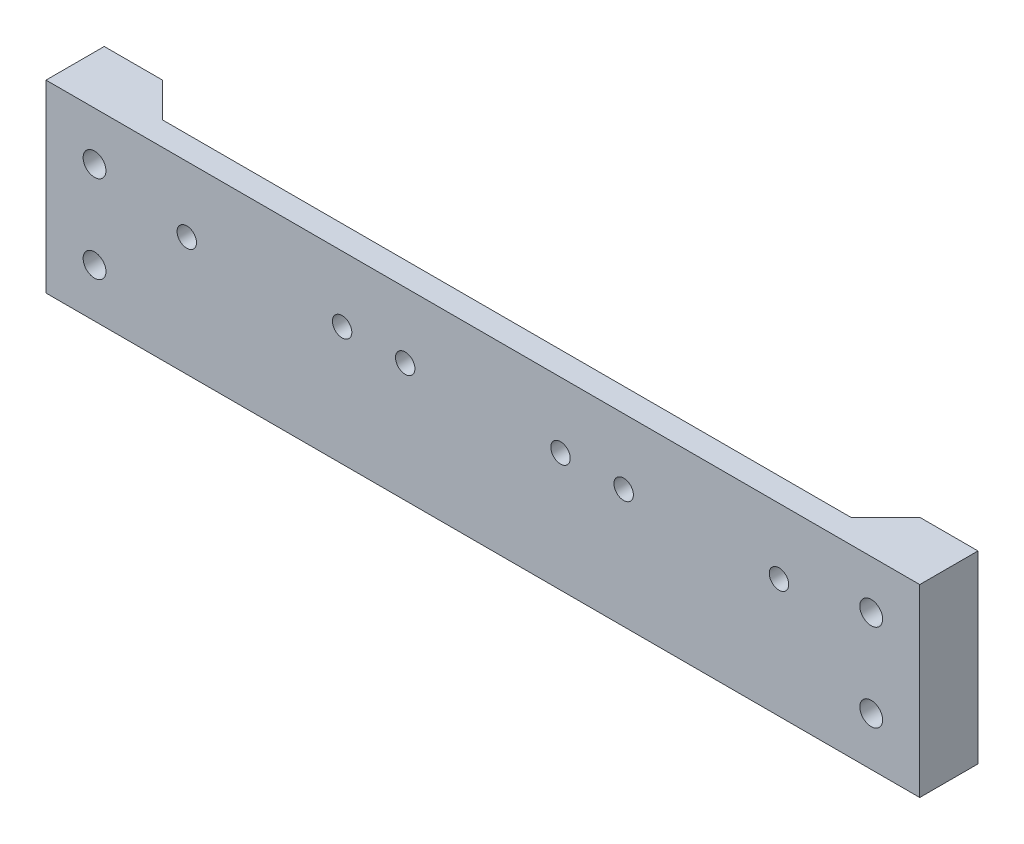
ISO-10303-21;
HEADER;
FILE_DESCRIPTION(('STEP AP214'),'2;1');
FILE_NAME('part.step','',(''),(''),'','','');
FILE_SCHEMA(('AUTOMOTIVE_DESIGN { 1 0 10303 214 1 1 1 1 }'));
ENDSEC;
DATA;
#1=APPLICATION_CONTEXT('core data for automotive mechanical design processes');
#2=APPLICATION_PROTOCOL_DEFINITION('international standard','automotive_design',2000,#1);
#3=PRODUCT_CONTEXT('',#1,'mechanical');
#4=PRODUCT('Part','Part','',(#3));
#5=PRODUCT_RELATED_PRODUCT_CATEGORY('part','',(#4));
#6=PRODUCT_DEFINITION_FORMATION('','',#4);
#7=PRODUCT_DEFINITION_CONTEXT('part definition',#1,'design');
#8=PRODUCT_DEFINITION('design','',#6,#7);
#9=PRODUCT_DEFINITION_SHAPE('','',#8);
#10=(LENGTH_UNIT() NAMED_UNIT(*) SI_UNIT(.MILLI.,.METRE.));
#11=(NAMED_UNIT(*) PLANE_ANGLE_UNIT() SI_UNIT($,.RADIAN.));
#12=(NAMED_UNIT(*) SI_UNIT($,.STERADIAN.) SOLID_ANGLE_UNIT());
#13=UNCERTAINTY_MEASURE_WITH_UNIT(LENGTH_MEASURE(1.E-05),#10,'distance_accuracy_value','');
#14=(GEOMETRIC_REPRESENTATION_CONTEXT(3) GLOBAL_UNCERTAINTY_ASSIGNED_CONTEXT((#13)) GLOBAL_UNIT_ASSIGNED_CONTEXT((#10,
#11,#12)) REPRESENTATION_CONTEXT('',''));
#15=CARTESIAN_POINT('',(0.,0.,0.));
#16=DIRECTION('',(0.,0.,1.));
#17=DIRECTION('',(1.,0.,0.));
#18=AXIS2_PLACEMENT_3D('',#15,#16,#17);
#19=CARTESIAN_POINT('',(0.,0.,0.));
#20=DIRECTION('',(0.,0.,-1.));
#21=DIRECTION('',(-1.,0.,0.));
#22=AXIS2_PLACEMENT_3D('',#19,#20,#21);
#23=PLANE('',#22);
#24=DIRECTION('',(0.,1.,0.));
#25=VECTOR('',#24,1.);
#26=CARTESIAN_POINT('',(168.,-38.,0.));
#27=LINE('',#26,#25);
#28=CARTESIAN_POINT('',(168.,-8.76610373207475,0.));
#29=VERTEX_POINT('',#28);
#30=CARTESIAN_POINT('',(168.,0.,0.));
#31=VERTEX_POINT('',#30);
#32=EDGE_CURVE('E217',#29,#31,#27,.T.);
#33=ORIENTED_EDGE('',*,*,#32,.T.);
#34=DIRECTION('',(-1.,0.,0.));
#35=VECTOR('',#34,1.);
#36=CARTESIAN_POINT('',(0.,0.,0.));
#37=LINE('',#36,#35);
#38=CARTESIAN_POINT('',(180.,0.,0.));
#39=VERTEX_POINT('',#38);
#40=EDGE_CURVE('E168',#39,#31,#37,.T.);
#41=ORIENTED_EDGE('',*,*,#40,.F.);
#42=DIRECTION('',(0.,1.,0.));
#43=VECTOR('',#42,1.);
#44=CARTESIAN_POINT('',(180.,-38.,0.));
#45=LINE('',#44,#43);
#46=CARTESIAN_POINT('',(180.,-38.,0.));
#47=VERTEX_POINT('',#46);
#48=EDGE_CURVE('E160',#47,#39,#45,.T.);
#49=ORIENTED_EDGE('',*,*,#48,.F.);
#50=DIRECTION('',(1.,0.,0.));
#51=VECTOR('',#50,1.);
#52=CARTESIAN_POINT('',(0.,-38.,0.));
#53=LINE('',#52,#51);
#54=CARTESIAN_POINT('',(168.,-38.,0.));
#55=VERTEX_POINT('',#54);
#56=EDGE_CURVE('E161',#55,#47,#53,.T.);
#57=ORIENTED_EDGE('',*,*,#56,.F.);
#58=CARTESIAN_POINT('',(168.,-29.2308270553853,0.));
#59=VERTEX_POINT('',#58);
#60=EDGE_CURVE('E212',#55,#59,#27,.T.);
#61=ORIENTED_EDGE('',*,*,#60,.T.);
#62=CARTESIAN_POINT('',(170.,-27.99693078746,0.));
#63=DIRECTION('',(0.,0.,1.));
#64=DIRECTION('',(1.,0.,0.));
#65=AXIS2_PLACEMENT_3D('',#62,#63,#64);
#66=CIRCLE('',#65,2.35);
#67=CARTESIAN_POINT('',(168.,-26.7630345195348,0.));
#68=VERTEX_POINT('',#67);
#69=EDGE_CURVE('E238',#59,#68,#66,.T.);
#70=ORIENTED_EDGE('',*,*,#69,.T.);
#71=CARTESIAN_POINT('',(168.,-11.2338962679253,0.));
#72=VERTEX_POINT('',#71);
#73=EDGE_CURVE('E216',#68,#72,#27,.T.);
#74=ORIENTED_EDGE('',*,*,#73,.T.);
#75=CARTESIAN_POINT('',(170.,-10.,0.));
#76=DIRECTION('',(0.,0.,1.));
#77=DIRECTION('',(1.,0.,0.));
#78=AXIS2_PLACEMENT_3D('',#75,#76,#77);
#79=CIRCLE('',#78,2.35);
#80=EDGE_CURVE('E232',#72,#29,#79,.T.);
#81=ORIENTED_EDGE('',*,*,#80,.T.);
#82=EDGE_LOOP('',(#33,#41,#49,#57,#61,#70,#74,#81));
#83=FACE_BOUND('',#82,.T.);
#84=ADVANCED_FACE('F37',(#83),#23,.T.);
#85=CARTESIAN_POINT('',(0.,0.,12.));
#86=DIRECTION('',(0.,0.,-1.));
#87=DIRECTION('',(-1.,0.,0.));
#88=AXIS2_PLACEMENT_3D('',#85,#86,#87);
#89=PLANE('',#88);
#90=CARTESIAN_POINT('',(151.,-13.5,12.));
#91=DIRECTION('',(0.,0.,1.));
#92=DIRECTION('',(1.,0.,0.));
#93=AXIS2_PLACEMENT_3D('',#90,#91,#92);
#94=CIRCLE('',#93,2.);
#95=CARTESIAN_POINT('',(153.,-13.5,12.));
#96=VERTEX_POINT('',#95);
#97=EDGE_CURVE('E186',#96,#96,#94,.T.);
#98=ORIENTED_EDGE('',*,*,#97,.F.);
#99=EDGE_LOOP('',(#98));
#100=FACE_BOUND('',#99,.T.);
#101=CARTESIAN_POINT('',(119.,-13.5,12.));
#102=DIRECTION('',(0.,0.,1.));
#103=DIRECTION('',(1.,0.,0.));
#104=AXIS2_PLACEMENT_3D('',#101,#102,#103);
#105=CIRCLE('',#104,2.);
#106=CARTESIAN_POINT('',(121.,-13.5,12.));
#107=VERTEX_POINT('',#106);
#108=EDGE_CURVE('E492',#107,#107,#105,.T.);
#109=ORIENTED_EDGE('',*,*,#108,.F.);
#110=EDGE_LOOP('',(#109));
#111=FACE_BOUND('',#110,.T.);
#112=CARTESIAN_POINT('',(106.,-13.5,12.));
#113=DIRECTION('',(0.,0.,1.));
#114=DIRECTION('',(1.,0.,0.));
#115=AXIS2_PLACEMENT_3D('',#112,#113,#114);
#116=CIRCLE('',#115,2.);
#117=CARTESIAN_POINT('',(108.,-13.5,12.));
#118=VERTEX_POINT('',#117);
#119=EDGE_CURVE('E495',#118,#118,#116,.T.);
#120=ORIENTED_EDGE('',*,*,#119,.F.);
#121=EDGE_LOOP('',(#120));
#122=FACE_BOUND('',#121,.T.);
#123=CARTESIAN_POINT('',(74.,-13.5,12.));
#124=DIRECTION('',(0.,0.,1.));
#125=DIRECTION('',(1.,0.,0.));
#126=AXIS2_PLACEMENT_3D('',#123,#124,#125);
#127=CIRCLE('',#126,2.);
#128=CARTESIAN_POINT('',(76.,-13.5,12.));
#129=VERTEX_POINT('',#128);
#130=EDGE_CURVE('E500',#129,#129,#127,.T.);
#131=ORIENTED_EDGE('',*,*,#130,.F.);
#132=EDGE_LOOP('',(#131));
#133=FACE_BOUND('',#132,.T.);
#134=CARTESIAN_POINT('',(61.,-13.5,12.));
#135=DIRECTION('',(0.,0.,1.));
#136=DIRECTION('',(1.,0.,0.));
#137=AXIS2_PLACEMENT_3D('',#134,#135,#136);
#138=CIRCLE('',#137,2.);
#139=CARTESIAN_POINT('',(63.,-13.5,12.));
#140=VERTEX_POINT('',#139);
#141=EDGE_CURVE('E503',#140,#140,#138,.T.);
#142=ORIENTED_EDGE('',*,*,#141,.F.);
#143=EDGE_LOOP('',(#142));
#144=FACE_BOUND('',#143,.T.);
#145=CARTESIAN_POINT('',(29.,-13.5,12.));
#146=DIRECTION('',(0.,0.,1.));
#147=DIRECTION('',(1.,0.,0.));
#148=AXIS2_PLACEMENT_3D('',#145,#146,#147);
#149=CIRCLE('',#148,2.);
#150=CARTESIAN_POINT('',(31.,-13.5,12.));
#151=VERTEX_POINT('',#150);
#152=EDGE_CURVE('E506',#151,#151,#149,.T.);
#153=ORIENTED_EDGE('',*,*,#152,.F.);
#154=EDGE_LOOP('',(#153));
#155=FACE_BOUND('',#154,.T.);
#156=DIRECTION('',(0.,-1.,0.));
#157=VECTOR('',#156,1.);
#158=CARTESIAN_POINT('',(0.,-38.,12.));
#159=LINE('',#158,#157);
#160=CARTESIAN_POINT('',(0.,0.,12.));
#161=VERTEX_POINT('',#160);
#162=CARTESIAN_POINT('',(0.,-38.,12.));
#163=VERTEX_POINT('',#162);
#164=EDGE_CURVE('E171',#161,#163,#159,.T.);
#165=ORIENTED_EDGE('',*,*,#164,.T.);
#166=DIRECTION('',(1.,0.,0.));
#167=VECTOR('',#166,1.);
#168=CARTESIAN_POINT('',(0.,-38.,12.));
#169=LINE('',#168,#167);
#170=CARTESIAN_POINT('',(180.,-38.,12.));
#171=VERTEX_POINT('',#170);
#172=EDGE_CURVE('E92',#163,#171,#169,.T.);
#173=ORIENTED_EDGE('',*,*,#172,.T.);
#174=DIRECTION('',(0.,1.,0.));
#175=VECTOR('',#174,1.);
#176=CARTESIAN_POINT('',(180.,-38.,12.));
#177=LINE('',#176,#175);
#178=CARTESIAN_POINT('',(180.,0.,12.));
#179=VERTEX_POINT('',#178);
#180=EDGE_CURVE('E248',#171,#179,#177,.T.);
#181=ORIENTED_EDGE('',*,*,#180,.T.);
#182=DIRECTION('',(-1.,0.,0.));
#183=VECTOR('',#182,1.);
#184=CARTESIAN_POINT('',(0.,0.,12.));
#185=LINE('',#184,#183);
#186=EDGE_CURVE('E63',#179,#161,#185,.T.);
#187=ORIENTED_EDGE('',*,*,#186,.T.);
#188=EDGE_LOOP('',(#165,#173,#181,#187));
#189=FACE_BOUND('',#188,.T.);
#190=CARTESIAN_POINT('',(170.,-27.99693078746,12.));
#191=DIRECTION('',(0.,0.,1.));
#192=DIRECTION('',(1.,0.,0.));
#193=AXIS2_PLACEMENT_3D('',#190,#191,#192);
#194=CIRCLE('',#193,2.35);
#195=CARTESIAN_POINT('',(172.35,-27.99693078746,12.));
#196=VERTEX_POINT('',#195);
#197=EDGE_CURVE('E241',#196,#196,#194,.T.);
#198=ORIENTED_EDGE('',*,*,#197,.F.);
#199=EDGE_LOOP('',(#198));
#200=FACE_BOUND('',#199,.T.);
#201=CARTESIAN_POINT('',(170.,-10.,12.));
#202=DIRECTION('',(0.,0.,1.));
#203=DIRECTION('',(1.,0.,0.));
#204=AXIS2_PLACEMENT_3D('',#201,#202,#203);
#205=CIRCLE('',#204,2.35);
#206=CARTESIAN_POINT('',(172.35,-10.,12.));
#207=VERTEX_POINT('',#206);
#208=EDGE_CURVE('E235',#207,#207,#205,.T.);
#209=ORIENTED_EDGE('',*,*,#208,.F.);
#210=EDGE_LOOP('',(#209));
#211=FACE_BOUND('',#210,.T.);
#212=CARTESIAN_POINT('',(10.,-10.,12.));
#213=DIRECTION('',(0.,0.,1.));
#214=DIRECTION('',(1.,0.,0.));
#215=AXIS2_PLACEMENT_3D('',#212,#213,#214);
#216=CIRCLE('',#215,2.35);
#217=CARTESIAN_POINT('',(12.35,-10.,12.));
#218=VERTEX_POINT('',#217);
#219=EDGE_CURVE('E229',#218,#218,#216,.T.);
#220=ORIENTED_EDGE('',*,*,#219,.F.);
#221=EDGE_LOOP('',(#220));
#222=FACE_BOUND('',#221,.T.);
#223=CARTESIAN_POINT('',(10.,-27.99693078746,12.));
#224=DIRECTION('',(0.,0.,1.));
#225=DIRECTION('',(1.,0.,0.));
#226=AXIS2_PLACEMENT_3D('',#223,#224,#225);
#227=CIRCLE('',#226,2.35);
#228=CARTESIAN_POINT('',(12.35,-27.99693078746,12.));
#229=VERTEX_POINT('',#228);
#230=EDGE_CURVE('E224',#229,#229,#227,.T.);
#231=ORIENTED_EDGE('',*,*,#230,.F.);
#232=EDGE_LOOP('',(#231));
#233=FACE_BOUND('',#232,.T.);
#234=ADVANCED_FACE('F251',(#100,#111,#122,#133,#144,#155,#189,#200,#211,#222,#233),#89,.F.);
#235=DIRECTION('',(0.,1.,0.));
#236=VECTOR('',#235,1.);
#237=CARTESIAN_POINT('',(12.,-38.,0.));
#238=LINE('',#237,#236);
#239=CARTESIAN_POINT('',(12.,-38.,0.));
#240=VERTEX_POINT('',#239);
#241=CARTESIAN_POINT('',(12.,-29.2308270553854,0.));
#242=VERTEX_POINT('',#241);
#243=EDGE_CURVE('E54',#240,#242,#238,.T.);
#244=ORIENTED_EDGE('',*,*,#243,.F.);
#245=CARTESIAN_POINT('',(0.,-38.,0.));
#246=VERTEX_POINT('',#245);
#247=EDGE_CURVE('E149',#246,#240,#53,.T.);
#248=ORIENTED_EDGE('',*,*,#247,.F.);
#249=DIRECTION('',(0.,-1.,0.));
#250=VECTOR('',#249,1.);
#251=CARTESIAN_POINT('',(0.,-38.,0.));
#252=LINE('',#251,#250);
#253=CARTESIAN_POINT('',(0.,0.,0.));
#254=VERTEX_POINT('',#253);
#255=EDGE_CURVE('E164',#254,#246,#252,.T.);
#256=ORIENTED_EDGE('',*,*,#255,.F.);
#257=CARTESIAN_POINT('',(12.,0.,0.));
#258=VERTEX_POINT('',#257);
#259=EDGE_CURVE('E84',#258,#254,#37,.T.);
#260=ORIENTED_EDGE('',*,*,#259,.F.);
#261=CARTESIAN_POINT('',(12.,-8.76610373207467,0.));
#262=VERTEX_POINT('',#261);
#263=EDGE_CURVE('E155',#262,#258,#238,.T.);
#264=ORIENTED_EDGE('',*,*,#263,.F.);
#265=CARTESIAN_POINT('',(10.,-10.,0.));
#266=DIRECTION('',(0.,0.,1.));
#267=DIRECTION('',(1.,0.,0.));
#268=AXIS2_PLACEMENT_3D('',#265,#266,#267);
#269=CIRCLE('',#268,2.35);
#270=CARTESIAN_POINT('',(12.,-11.2338962679253,0.));
#271=VERTEX_POINT('',#270);
#272=EDGE_CURVE('E227',#262,#271,#269,.T.);
#273=ORIENTED_EDGE('',*,*,#272,.T.);
#274=CARTESIAN_POINT('',(12.,-26.7630345195347,0.));
#275=VERTEX_POINT('',#274);
#276=EDGE_CURVE('E153',#275,#271,#238,.T.);
#277=ORIENTED_EDGE('',*,*,#276,.F.);
#278=CARTESIAN_POINT('',(10.,-27.99693078746,0.));
#279=DIRECTION('',(0.,0.,1.));
#280=DIRECTION('',(1.,0.,0.));
#281=AXIS2_PLACEMENT_3D('',#278,#279,#280);
#282=CIRCLE('',#281,2.35);
#283=EDGE_CURVE('E152',#275,#242,#282,.T.);
#284=ORIENTED_EDGE('',*,*,#283,.T.);
#285=EDGE_LOOP('',(#244,#248,#256,#260,#264,#273,#277,#284));
#286=FACE_BOUND('',#285,.T.);
#287=ADVANCED_FACE('F147',(#286),#23,.T.);
#288=CARTESIAN_POINT('',(0.,-38.,12.));
#289=DIRECTION('',(1.,0.,0.));
#290=DIRECTION('',(0.,0.,-1.));
#291=AXIS2_PLACEMENT_3D('',#288,#289,#290);
#292=PLANE('',#291);
#293=ORIENTED_EDGE('',*,*,#255,.T.);
#294=DIRECTION('',(0.,0.,-1.));
#295=VECTOR('',#294,1.);
#296=CARTESIAN_POINT('',(0.,-38.,12.));
#297=LINE('',#296,#295);
#298=EDGE_CURVE('E158',#163,#246,#297,.T.);
#299=ORIENTED_EDGE('',*,*,#298,.F.);
#300=ORIENTED_EDGE('',*,*,#164,.F.);
#301=DIRECTION('',(0.,0.,-1.));
#302=VECTOR('',#301,1.);
#303=CARTESIAN_POINT('',(0.,0.,12.));
#304=LINE('',#303,#302);
#305=EDGE_CURVE('E172',#161,#254,#304,.T.);
#306=ORIENTED_EDGE('',*,*,#305,.T.);
#307=EDGE_LOOP('',(#293,#299,#300,#306));
#308=FACE_BOUND('',#307,.T.);
#309=ADVANCED_FACE('F39',(#308),#292,.F.);
#310=CARTESIAN_POINT('',(0.,-38.,12.));
#311=DIRECTION('',(0.,1.,0.));
#312=DIRECTION('',(0.,0.,1.));
#313=AXIS2_PLACEMENT_3D('',#310,#311,#312);
#314=PLANE('',#313);
#315=DIRECTION('',(1.,0.,0.));
#316=VECTOR('',#315,1.);
#317=CARTESIAN_POINT('',(160.9,-38.,7.1));
#318=LINE('',#317,#316);
#319=CARTESIAN_POINT('',(19.1,-38.,7.10000000000002));
#320=VERTEX_POINT('',#319);
#321=CARTESIAN_POINT('',(160.9,-38.,7.1));
#322=VERTEX_POINT('',#321);
#323=EDGE_CURVE('E142',#320,#322,#318,.T.);
#324=ORIENTED_EDGE('',*,*,#323,.T.);
#325=DIRECTION('',(0.707106781186549,0.,-0.707106781186546));
#326=VECTOR('',#325,1.);
#327=CARTESIAN_POINT('',(168.,-38.,0.));
#328=LINE('',#327,#326);
#329=EDGE_CURVE('E208',#322,#55,#328,.T.);
#330=ORIENTED_EDGE('',*,*,#329,.T.);
#331=ORIENTED_EDGE('',*,*,#56,.T.);
#332=DIRECTION('',(0.,0.,-1.));
#333=VECTOR('',#332,1.);
#334=CARTESIAN_POINT('',(180.,-38.,12.));
#335=LINE('',#334,#333);
#336=EDGE_CURVE('E177',#171,#47,#335,.T.);
#337=ORIENTED_EDGE('',*,*,#336,.F.);
#338=ORIENTED_EDGE('',*,*,#172,.F.);
#339=ORIENTED_EDGE('',*,*,#298,.T.);
#340=ORIENTED_EDGE('',*,*,#247,.T.);
#341=DIRECTION('',(0.707106781186545,0.,0.707106781186549));
#342=VECTOR('',#341,1.);
#343=CARTESIAN_POINT('',(19.1,-38.,7.10000000000002));
#344=LINE('',#343,#342);
#345=EDGE_CURVE('E135',#240,#320,#344,.T.);
#346=ORIENTED_EDGE('',*,*,#345,.T.);
#347=EDGE_LOOP('',(#324,#330,#331,#337,#338,#339,#340,#346));
#348=FACE_BOUND('',#347,.T.);
#349=ADVANCED_FACE('F156',(#348),#314,.F.);
#350=CARTESIAN_POINT('',(180.,-38.,12.));
#351=DIRECTION('',(-1.,0.,0.));
#352=DIRECTION('',(0.,0.,1.));
#353=AXIS2_PLACEMENT_3D('',#350,#351,#352);
#354=PLANE('',#353);
#355=ORIENTED_EDGE('',*,*,#48,.T.);
#356=DIRECTION('',(0.,0.,-1.));
#357=VECTOR('',#356,1.);
#358=CARTESIAN_POINT('',(180.,0.,12.));
#359=LINE('',#358,#357);
#360=EDGE_CURVE('E174',#179,#39,#359,.T.);
#361=ORIENTED_EDGE('',*,*,#360,.F.);
#362=ORIENTED_EDGE('',*,*,#180,.F.);
#363=ORIENTED_EDGE('',*,*,#336,.T.);
#364=EDGE_LOOP('',(#355,#361,#362,#363));
#365=FACE_BOUND('',#364,.T.);
#366=ADVANCED_FACE('F254',(#365),#354,.F.);
#367=CARTESIAN_POINT('',(0.,0.,12.));
#368=DIRECTION('',(0.,-1.,0.));
#369=DIRECTION('',(0.,0.,-1.));
#370=AXIS2_PLACEMENT_3D('',#367,#368,#369);
#371=PLANE('',#370);
#372=ORIENTED_EDGE('',*,*,#40,.T.);
#373=DIRECTION('',(0.707106781186549,0.,-0.707106781186546));
#374=VECTOR('',#373,1.);
#375=CARTESIAN_POINT('',(168.,0.,0.));
#376=LINE('',#375,#374);
#377=CARTESIAN_POINT('',(160.9,0.,7.1));
#378=VERTEX_POINT('',#377);
#379=EDGE_CURVE('E143',#378,#31,#376,.T.);
#380=ORIENTED_EDGE('',*,*,#379,.F.);
#381=DIRECTION('',(1.,0.,0.));
#382=VECTOR('',#381,1.);
#383=CARTESIAN_POINT('',(160.9,0.,7.1));
#384=LINE('',#383,#382);
#385=CARTESIAN_POINT('',(19.1,0.,7.10000000000002));
#386=VERTEX_POINT('',#385);
#387=EDGE_CURVE('E202',#386,#378,#384,.T.);
#388=ORIENTED_EDGE('',*,*,#387,.F.);
#389=DIRECTION('',(0.707106781186545,0.,0.707106781186549));
#390=VECTOR('',#389,1.);
#391=CARTESIAN_POINT('',(19.1,0.,7.10000000000002));
#392=LINE('',#391,#390);
#393=EDGE_CURVE('E199',#258,#386,#392,.T.);
#394=ORIENTED_EDGE('',*,*,#393,.F.);
#395=ORIENTED_EDGE('',*,*,#259,.T.);
#396=ORIENTED_EDGE('',*,*,#305,.F.);
#397=ORIENTED_EDGE('',*,*,#186,.F.);
#398=ORIENTED_EDGE('',*,*,#360,.T.);
#399=EDGE_LOOP('',(#372,#380,#388,#394,#395,#396,#397,#398));
#400=FACE_BOUND('',#399,.T.);
#401=ADVANCED_FACE('F257',(#400),#371,.F.);
#402=CARTESIAN_POINT('',(170.,-27.99693078746,12.));
#403=DIRECTION('',(0.,0.,-1.));
#404=DIRECTION('',(-1.,0.,0.));
#405=AXIS2_PLACEMENT_3D('',#402,#403,#404);
#406=CYLINDRICAL_SURFACE('',#405,2.35);
#407=CARTESIAN_POINT('',(170.,-27.99693078746,-2.00000000000002));
#408=DIRECTION('',(0.707106781186546,0.,0.707106781186549));
#409=DIRECTION('',(0.707106781186549,0.,-0.707106781186546));
#410=AXIS2_PLACEMENT_3D('',#407,#408,#409);
#411=ELLIPSE('',#410,3.32340187157677,2.35);
#412=EDGE_CURVE('E222',#68,#59,#411,.T.);
#413=ORIENTED_EDGE('',*,*,#412,.F.);
#414=ORIENTED_EDGE('',*,*,#69,.F.);
#415=EDGE_LOOP('',(#413,#414));
#416=FACE_BOUND('',#415,.T.);
#417=ORIENTED_EDGE('',*,*,#197,.T.);
#418=EDGE_LOOP('',(#417));
#419=FACE_BOUND('',#418,.T.);
#420=ADVANCED_FACE('F286',(#416,#419),#406,.F.);
#421=CARTESIAN_POINT('',(170.,-10.,12.));
#422=DIRECTION('',(0.,0.,-1.));
#423=DIRECTION('',(-1.,0.,0.));
#424=AXIS2_PLACEMENT_3D('',#421,#422,#423);
#425=CYLINDRICAL_SURFACE('',#424,2.35);
#426=CARTESIAN_POINT('',(170.,-10.,-2.00000000000002));
#427=DIRECTION('',(0.707106781186546,0.,0.707106781186549));
#428=DIRECTION('',(0.707106781186549,0.,-0.707106781186546));
#429=AXIS2_PLACEMENT_3D('',#426,#427,#428);
#430=ELLIPSE('',#429,3.32340187157677,2.35);
#431=EDGE_CURVE('E11',#29,#72,#430,.T.);
#432=ORIENTED_EDGE('',*,*,#431,.F.);
#433=ORIENTED_EDGE('',*,*,#80,.F.);
#434=EDGE_LOOP('',(#432,#433));
#435=FACE_BOUND('',#434,.T.);
#436=ORIENTED_EDGE('',*,*,#208,.T.);
#437=EDGE_LOOP('',(#436));
#438=FACE_BOUND('',#437,.T.);
#439=ADVANCED_FACE('F330',(#435,#438),#425,.F.);
#440=CARTESIAN_POINT('',(10.,-10.,12.));
#441=DIRECTION('',(0.,0.,-1.));
#442=DIRECTION('',(-1.,0.,0.));
#443=AXIS2_PLACEMENT_3D('',#440,#441,#442);
#444=CYLINDRICAL_SURFACE('',#443,2.35);
#445=CARTESIAN_POINT('',(10.,-10.,-2.));
#446=DIRECTION('',(-0.707106781186549,0.,0.707106781186546));
#447=DIRECTION('',(-0.707106781186546,0.,-0.707106781186549));
#448=AXIS2_PLACEMENT_3D('',#445,#446,#447);
#449=ELLIPSE('',#448,3.32340187157679,2.35);
#450=EDGE_CURVE('E215',#271,#262,#449,.T.);
#451=ORIENTED_EDGE('',*,*,#450,.F.);
#452=ORIENTED_EDGE('',*,*,#272,.F.);
#453=EDGE_LOOP('',(#451,#452));
#454=FACE_BOUND('',#453,.T.);
#455=ORIENTED_EDGE('',*,*,#219,.T.);
#456=EDGE_LOOP('',(#455));
#457=FACE_BOUND('',#456,.T.);
#458=ADVANCED_FACE('F264',(#454,#457),#444,.F.);
#459=CARTESIAN_POINT('',(10.,-27.99693078746,12.));
#460=DIRECTION('',(0.,0.,-1.));
#461=DIRECTION('',(-1.,0.,0.));
#462=AXIS2_PLACEMENT_3D('',#459,#460,#461);
#463=CYLINDRICAL_SURFACE('',#462,2.35);
#464=CARTESIAN_POINT('',(10.,-27.99693078746,-2.));
#465=DIRECTION('',(-0.707106781186549,0.,0.707106781186546));
#466=DIRECTION('',(-0.707106781186546,0.,-0.707106781186549));
#467=AXIS2_PLACEMENT_3D('',#464,#465,#466);
#468=ELLIPSE('',#467,3.32340187157678,2.35);
#469=EDGE_CURVE('E46',#242,#275,#468,.T.);
#470=ORIENTED_EDGE('',*,*,#469,.F.);
#471=ORIENTED_EDGE('',*,*,#283,.F.);
#472=EDGE_LOOP('',(#470,#471));
#473=FACE_BOUND('',#472,.T.);
#474=ORIENTED_EDGE('',*,*,#230,.T.);
#475=EDGE_LOOP('',(#474));
#476=FACE_BOUND('',#475,.T.);
#477=ADVANCED_FACE('F267',(#473,#476),#463,.F.);
#478=CARTESIAN_POINT('',(168.,-38.,0.));
#479=DIRECTION('',(0.707106781186546,0.,0.707106781186549));
#480=DIRECTION('',(0.707106781186549,0.,-0.707106781186546));
#481=AXIS2_PLACEMENT_3D('',#478,#479,#480);
#482=PLANE('',#481);
#483=ORIENTED_EDGE('',*,*,#412,.T.);
#484=ORIENTED_EDGE('',*,*,#60,.F.);
#485=ORIENTED_EDGE('',*,*,#329,.F.);
#486=DIRECTION('',(0.,1.,0.));
#487=VECTOR('',#486,1.);
#488=CARTESIAN_POINT('',(160.9,-38.,7.1));
#489=LINE('',#488,#487);
#490=EDGE_CURVE('E218',#322,#378,#489,.T.);
#491=ORIENTED_EDGE('',*,*,#490,.T.);
#492=ORIENTED_EDGE('',*,*,#379,.T.);
#493=ORIENTED_EDGE('',*,*,#32,.F.);
#494=ORIENTED_EDGE('',*,*,#431,.T.);
#495=ORIENTED_EDGE('',*,*,#73,.F.);
#496=EDGE_LOOP('',(#483,#484,#485,#491,#492,#493,#494,#495));
#497=FACE_BOUND('',#496,.T.);
#498=ADVANCED_FACE('F270',(#497),#482,.F.);
#499=CARTESIAN_POINT('',(160.9,-38.,7.1));
#500=DIRECTION('',(0.,0.,1.));
#501=DIRECTION('',(1.,0.,0.));
#502=AXIS2_PLACEMENT_3D('',#499,#500,#501);
#503=PLANE('',#502);
#504=CARTESIAN_POINT('',(151.,-13.5,7.1));
#505=DIRECTION('',(0.,0.,1.));
#506=DIRECTION('',(1.,0.,0.));
#507=AXIS2_PLACEMENT_3D('',#504,#505,#506);
#508=CIRCLE('',#507,2.);
#509=CARTESIAN_POINT('',(153.,-13.5,7.1));
#510=VERTEX_POINT('',#509);
#511=EDGE_CURVE('E41',#510,#510,#508,.T.);
#512=ORIENTED_EDGE('',*,*,#511,.T.);
#513=EDGE_LOOP('',(#512));
#514=FACE_BOUND('',#513,.T.);
#515=CARTESIAN_POINT('',(119.,-13.5,7.10000000000001));
#516=DIRECTION('',(0.,0.,1.));
#517=DIRECTION('',(1.,0.,0.));
#518=AXIS2_PLACEMENT_3D('',#515,#516,#517);
#519=CIRCLE('',#518,2.);
#520=CARTESIAN_POINT('',(121.,-13.5,7.10000000000001));
#521=VERTEX_POINT('',#520);
#522=EDGE_CURVE('E194',#521,#521,#519,.T.);
#523=ORIENTED_EDGE('',*,*,#522,.T.);
#524=EDGE_LOOP('',(#523));
#525=FACE_BOUND('',#524,.T.);
#526=CARTESIAN_POINT('',(106.,-13.5,7.10000000000001));
#527=DIRECTION('',(0.,0.,1.));
#528=DIRECTION('',(1.,0.,0.));
#529=AXIS2_PLACEMENT_3D('',#526,#527,#528);
#530=CIRCLE('',#529,2.);
#531=CARTESIAN_POINT('',(108.,-13.5,7.10000000000001));
#532=VERTEX_POINT('',#531);
#533=EDGE_CURVE('E192',#532,#532,#530,.T.);
#534=ORIENTED_EDGE('',*,*,#533,.T.);
#535=EDGE_LOOP('',(#534));
#536=FACE_BOUND('',#535,.T.);
#537=CARTESIAN_POINT('',(74.,-13.5,7.10000000000001));
#538=DIRECTION('',(0.,0.,1.));
#539=DIRECTION('',(1.,0.,0.));
#540=AXIS2_PLACEMENT_3D('',#537,#538,#539);
#541=CIRCLE('',#540,2.);
#542=CARTESIAN_POINT('',(76.,-13.5,7.10000000000001));
#543=VERTEX_POINT('',#542);
#544=EDGE_CURVE('E189',#543,#543,#541,.T.);
#545=ORIENTED_EDGE('',*,*,#544,.T.);
#546=EDGE_LOOP('',(#545));
#547=FACE_BOUND('',#546,.T.);
#548=CARTESIAN_POINT('',(61.,-13.5,7.10000000000002));
#549=DIRECTION('',(0.,0.,1.));
#550=DIRECTION('',(1.,0.,0.));
#551=AXIS2_PLACEMENT_3D('',#548,#549,#550);
#552=CIRCLE('',#551,2.);
#553=CARTESIAN_POINT('',(63.,-13.5,7.10000000000002));
#554=VERTEX_POINT('',#553);
#555=EDGE_CURVE('E185',#554,#554,#552,.T.);
#556=ORIENTED_EDGE('',*,*,#555,.T.);
#557=EDGE_LOOP('',(#556));
#558=FACE_BOUND('',#557,.T.);
#559=CARTESIAN_POINT('',(29.,-13.5,7.10000000000002));
#560=DIRECTION('',(0.,0.,1.));
#561=DIRECTION('',(1.,0.,0.));
#562=AXIS2_PLACEMENT_3D('',#559,#560,#561);
#563=CIRCLE('',#562,2.);
#564=CARTESIAN_POINT('',(31.,-13.5,7.10000000000002));
#565=VERTEX_POINT('',#564);
#566=EDGE_CURVE('E182',#565,#565,#563,.T.);
#567=ORIENTED_EDGE('',*,*,#566,.T.);
#568=EDGE_LOOP('',(#567));
#569=FACE_BOUND('',#568,.T.);
#570=ORIENTED_EDGE('',*,*,#387,.T.);
#571=ORIENTED_EDGE('',*,*,#490,.F.);
#572=ORIENTED_EDGE('',*,*,#323,.F.);
#573=DIRECTION('',(0.,1.,0.));
#574=VECTOR('',#573,1.);
#575=CARTESIAN_POINT('',(19.1,-38.,7.10000000000002));
#576=LINE('',#575,#574);
#577=EDGE_CURVE('E138',#320,#386,#576,.T.);
#578=ORIENTED_EDGE('',*,*,#577,.T.);
#579=EDGE_LOOP('',(#570,#571,#572,#578));
#580=FACE_BOUND('',#579,.T.);
#581=ADVANCED_FACE('F366',(#514,#525,#536,#547,#558,#569,#580),#503,.F.);
#582=CARTESIAN_POINT('',(19.1,-38.,7.10000000000002));
#583=DIRECTION('',(-0.707106781186549,0.,0.707106781186546));
#584=DIRECTION('',(0.707106781186546,0.,0.707106781186549));
#585=AXIS2_PLACEMENT_3D('',#582,#583,#584);
#586=PLANE('',#585);
#587=ORIENTED_EDGE('',*,*,#450,.T.);
#588=ORIENTED_EDGE('',*,*,#263,.T.);
#589=ORIENTED_EDGE('',*,*,#393,.T.);
#590=ORIENTED_EDGE('',*,*,#577,.F.);
#591=ORIENTED_EDGE('',*,*,#345,.F.);
#592=ORIENTED_EDGE('',*,*,#243,.T.);
#593=ORIENTED_EDGE('',*,*,#469,.T.);
#594=ORIENTED_EDGE('',*,*,#276,.T.);
#595=EDGE_LOOP('',(#587,#588,#589,#590,#591,#592,#593,#594));
#596=FACE_BOUND('',#595,.T.);
#597=ADVANCED_FACE('F136',(#596),#586,.F.);
#598=CARTESIAN_POINT('',(29.,-13.5,-10.));
#599=DIRECTION('',(0.,0.,1.));
#600=DIRECTION('',(1.,0.,0.));
#601=AXIS2_PLACEMENT_3D('',#598,#599,#600);
#602=CYLINDRICAL_SURFACE('',#601,2.);
#603=ORIENTED_EDGE('',*,*,#152,.T.);
#604=EDGE_LOOP('',(#603));
#605=FACE_BOUND('',#604,.T.);
#606=ORIENTED_EDGE('',*,*,#566,.F.);
#607=EDGE_LOOP('',(#606));
#608=FACE_BOUND('',#607,.T.);
#609=ADVANCED_FACE('F378',(#605,#608),#602,.F.);
#610=CARTESIAN_POINT('',(61.,-13.5,-10.));
#611=DIRECTION('',(0.,0.,1.));
#612=DIRECTION('',(1.,0.,0.));
#613=AXIS2_PLACEMENT_3D('',#610,#611,#612);
#614=CYLINDRICAL_SURFACE('',#613,2.);
#615=ORIENTED_EDGE('',*,*,#141,.T.);
#616=EDGE_LOOP('',(#615));
#617=FACE_BOUND('',#616,.T.);
#618=ORIENTED_EDGE('',*,*,#555,.F.);
#619=EDGE_LOOP('',(#618));
#620=FACE_BOUND('',#619,.T.);
#621=ADVANCED_FACE('F400',(#617,#620),#614,.F.);
#622=CARTESIAN_POINT('',(74.,-13.5,-10.));
#623=DIRECTION('',(0.,0.,1.));
#624=DIRECTION('',(1.,0.,0.));
#625=AXIS2_PLACEMENT_3D('',#622,#623,#624);
#626=CYLINDRICAL_SURFACE('',#625,2.);
#627=ORIENTED_EDGE('',*,*,#130,.T.);
#628=EDGE_LOOP('',(#627));
#629=FACE_BOUND('',#628,.T.);
#630=ORIENTED_EDGE('',*,*,#544,.F.);
#631=EDGE_LOOP('',(#630));
#632=FACE_BOUND('',#631,.T.);
#633=ADVANCED_FACE('F411',(#629,#632),#626,.F.);
#634=CARTESIAN_POINT('',(106.,-13.5,-10.));
#635=DIRECTION('',(0.,0.,1.));
#636=DIRECTION('',(1.,0.,0.));
#637=AXIS2_PLACEMENT_3D('',#634,#635,#636);
#638=CYLINDRICAL_SURFACE('',#637,2.);
#639=ORIENTED_EDGE('',*,*,#119,.T.);
#640=EDGE_LOOP('',(#639));
#641=FACE_BOUND('',#640,.T.);
#642=ORIENTED_EDGE('',*,*,#533,.F.);
#643=EDGE_LOOP('',(#642));
#644=FACE_BOUND('',#643,.T.);
#645=ADVANCED_FACE('F422',(#641,#644),#638,.F.);
#646=CARTESIAN_POINT('',(119.,-13.5,-10.));
#647=DIRECTION('',(0.,0.,1.));
#648=DIRECTION('',(1.,0.,0.));
#649=AXIS2_PLACEMENT_3D('',#646,#647,#648);
#650=CYLINDRICAL_SURFACE('',#649,2.);
#651=ORIENTED_EDGE('',*,*,#108,.T.);
#652=EDGE_LOOP('',(#651));
#653=FACE_BOUND('',#652,.T.);
#654=ORIENTED_EDGE('',*,*,#522,.F.);
#655=EDGE_LOOP('',(#654));
#656=FACE_BOUND('',#655,.T.);
#657=ADVANCED_FACE('F433',(#653,#656),#650,.F.);
#658=CARTESIAN_POINT('',(151.,-13.5,-10.));
#659=DIRECTION('',(0.,0.,1.));
#660=DIRECTION('',(1.,0.,0.));
#661=AXIS2_PLACEMENT_3D('',#658,#659,#660);
#662=CYLINDRICAL_SURFACE('',#661,2.);
#663=ORIENTED_EDGE('',*,*,#97,.T.);
#664=EDGE_LOOP('',(#663));
#665=FACE_BOUND('',#664,.T.);
#666=ORIENTED_EDGE('',*,*,#511,.F.);
#667=EDGE_LOOP('',(#666));
#668=FACE_BOUND('',#667,.T.);
#669=ADVANCED_FACE('F444',(#665,#668),#662,.F.);
#670=CLOSED_SHELL('',(#84,#234,#287,#309,#349,#366,#401,#420,#439,#458,#477,#498,#581,#597,#609,
#621,#633,#645,#657,#669));
#671=MANIFOLD_SOLID_BREP('B2',#670);
#672=ADVANCED_BREP_SHAPE_REPRESENTATION('',(#18,#671),#14);
#673=SHAPE_DEFINITION_REPRESENTATION(#9,#672);
ENDSEC;
END-ISO-10303-21;
